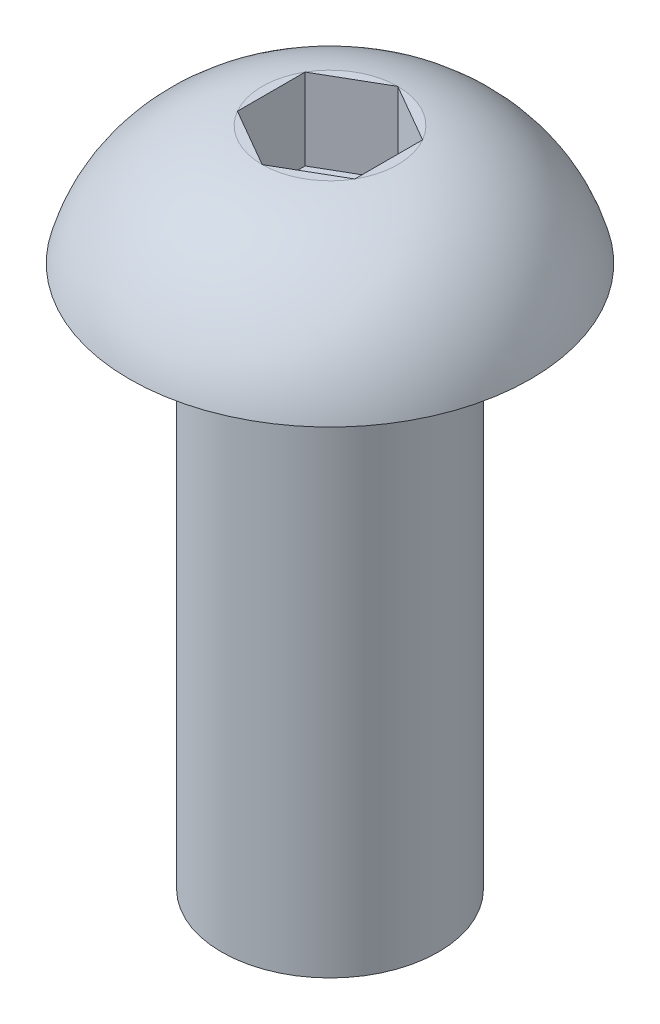
ISO-10303-21;
HEADER;
FILE_DESCRIPTION(('STEP AP214'),'2;1');
FILE_NAME('part.step','',(''),(''),'','','');
FILE_SCHEMA(('AUTOMOTIVE_DESIGN { 1 0 10303 214 1 1 1 1 }'));
ENDSEC;
DATA;
#1=APPLICATION_CONTEXT('core data for automotive mechanical design processes');
#2=APPLICATION_PROTOCOL_DEFINITION('international standard','automotive_design',2000,#1);
#3=PRODUCT_CONTEXT('',#1,'mechanical');
#4=PRODUCT('Part','Part','',(#3));
#5=PRODUCT_RELATED_PRODUCT_CATEGORY('part','',(#4));
#6=PRODUCT_DEFINITION_FORMATION('','',#4);
#7=PRODUCT_DEFINITION_CONTEXT('part definition',#1,'design');
#8=PRODUCT_DEFINITION('design','',#6,#7);
#9=PRODUCT_DEFINITION_SHAPE('','',#8);
#10=(LENGTH_UNIT() NAMED_UNIT(*) SI_UNIT(.MILLI.,.METRE.));
#11=(NAMED_UNIT(*) PLANE_ANGLE_UNIT() SI_UNIT($,.RADIAN.));
#12=(NAMED_UNIT(*) SI_UNIT($,.STERADIAN.) SOLID_ANGLE_UNIT());
#13=UNCERTAINTY_MEASURE_WITH_UNIT(LENGTH_MEASURE(1.E-05),#10,'distance_accuracy_value','');
#14=(GEOMETRIC_REPRESENTATION_CONTEXT(3) GLOBAL_UNCERTAINTY_ASSIGNED_CONTEXT((#13)) GLOBAL_UNIT_ASSIGNED_CONTEXT((#10,
#11,#12)) REPRESENTATION_CONTEXT('',''));
#15=CARTESIAN_POINT('',(0.,0.,0.));
#16=DIRECTION('',(0.,0.,1.));
#17=DIRECTION('',(1.,0.,0.));
#18=AXIS2_PLACEMENT_3D('',#15,#16,#17);
#19=CARTESIAN_POINT('',(0.,2.2,0.));
#20=DIRECTION('',(0.,1.,0.));
#21=DIRECTION('',(0.,0.,1.));
#22=AXIS2_PLACEMENT_3D('',#19,#20,#21);
#23=PLANE('',#22);
#24=DIRECTION('',(-0.866025403784439,0.,-0.5));
#25=VECTOR('',#24,1.);
#26=CARTESIAN_POINT('',(1.08253175473055,2.2,-0.625000000000001));
#27=LINE('',#26,#25);
#28=CARTESIAN_POINT('',(1.08253175473055,2.2,-0.625000000000001));
#29=VERTEX_POINT('',#28);
#30=CARTESIAN_POINT('',(0.,2.2,-1.25));
#31=VERTEX_POINT('',#30);
#32=EDGE_CURVE('E49',#29,#31,#27,.T.);
#33=ORIENTED_EDGE('',*,*,#32,.F.);
#34=CARTESIAN_POINT('',(0.,2.2,0.));
#35=DIRECTION('',(0.,1.,0.));
#36=DIRECTION('',(0.,0.,1.));
#37=AXIS2_PLACEMENT_3D('',#34,#35,#36);
#38=CIRCLE('',#37,1.25);
#39=EDGE_CURVE('E151',#29,#31,#38,.T.);
#40=ORIENTED_EDGE('',*,*,#39,.T.);
#41=EDGE_LOOP('',(#33,#40));
#42=FACE_BOUND('',#41,.T.);
#43=ADVANCED_FACE('F33',(#42),#23,.T.);
#44=DIRECTION('',(0.,0.,-1.));
#45=VECTOR('',#44,1.);
#46=CARTESIAN_POINT('',(1.08253175473055,2.2,0.625000000000001));
#47=LINE('',#46,#45);
#48=CARTESIAN_POINT('',(1.08253175473055,2.2,0.625000000000001));
#49=VERTEX_POINT('',#48);
#50=EDGE_CURVE('E132',#49,#29,#47,.T.);
#51=ORIENTED_EDGE('',*,*,#50,.F.);
#52=EDGE_CURVE('E146',#49,#29,#38,.T.);
#53=ORIENTED_EDGE('',*,*,#52,.T.);
#54=EDGE_LOOP('',(#51,#53));
#55=FACE_BOUND('',#54,.T.);
#56=ADVANCED_FACE('F174',(#55),#23,.T.);
#57=DIRECTION('',(0.866025403784439,0.,-0.5));
#58=VECTOR('',#57,1.);
#59=CARTESIAN_POINT('',(0.,2.2,1.25));
#60=LINE('',#59,#58);
#61=CARTESIAN_POINT('',(0.,2.2,1.25));
#62=VERTEX_POINT('',#61);
#63=EDGE_CURVE('E130',#62,#49,#60,.T.);
#64=ORIENTED_EDGE('',*,*,#63,.F.);
#65=EDGE_CURVE('E144',#62,#49,#38,.T.);
#66=ORIENTED_EDGE('',*,*,#65,.T.);
#67=EDGE_LOOP('',(#64,#66));
#68=FACE_BOUND('',#67,.T.);
#69=ADVANCED_FACE('F176',(#68),#23,.T.);
#70=DIRECTION('',(0.866025403784439,0.,0.5));
#71=VECTOR('',#70,1.);
#72=CARTESIAN_POINT('',(-1.08253175473055,2.2,0.625000000000001));
#73=LINE('',#72,#71);
#74=CARTESIAN_POINT('',(-1.08253175473055,2.2,0.625000000000001));
#75=VERTEX_POINT('',#74);
#76=EDGE_CURVE('E97',#75,#62,#73,.T.);
#77=ORIENTED_EDGE('',*,*,#76,.F.);
#78=EDGE_CURVE('E143',#75,#62,#38,.T.);
#79=ORIENTED_EDGE('',*,*,#78,.T.);
#80=EDGE_LOOP('',(#77,#79));
#81=FACE_BOUND('',#80,.T.);
#82=ADVANCED_FACE('F178',(#81),#23,.T.);
#83=DIRECTION('',(0.,0.,1.));
#84=VECTOR('',#83,1.);
#85=CARTESIAN_POINT('',(-1.08253175473055,2.2,-0.625));
#86=LINE('',#85,#84);
#87=CARTESIAN_POINT('',(-1.08253175473055,2.2,-0.625));
#88=VERTEX_POINT('',#87);
#89=EDGE_CURVE('E126',#88,#75,#86,.T.);
#90=ORIENTED_EDGE('',*,*,#89,.F.);
#91=EDGE_CURVE('E153',#88,#75,#38,.T.);
#92=ORIENTED_EDGE('',*,*,#91,.T.);
#93=EDGE_LOOP('',(#90,#92));
#94=FACE_BOUND('',#93,.T.);
#95=ADVANCED_FACE('F184',(#94),#23,.T.);
#96=CARTESIAN_POINT('',(0.,0.,0.));
#97=DIRECTION('',(0.,1.,0.));
#98=DIRECTION('',(0.,0.,1.));
#99=AXIS2_PLACEMENT_3D('',#96,#97,#98);
#100=PLANE('',#99);
#101=CARTESIAN_POINT('',(0.,0.,0.));
#102=DIRECTION('',(0.,-1.,0.));
#103=DIRECTION('',(0.,0.,-1.));
#104=AXIS2_PLACEMENT_3D('',#101,#102,#103);
#105=CIRCLE('',#104,2.);
#106=CARTESIAN_POINT('',(0.,0.,-2.));
#107=VERTEX_POINT('',#106);
#108=EDGE_CURVE('E11',#107,#107,#105,.T.);
#109=ORIENTED_EDGE('',*,*,#108,.F.);
#110=EDGE_LOOP('',(#109));
#111=FACE_BOUND('',#110,.T.);
#112=CARTESIAN_POINT('',(0.,0.,0.));
#113=DIRECTION('',(0.,1.,0.));
#114=DIRECTION('',(0.,0.,1.));
#115=AXIS2_PLACEMENT_3D('',#112,#113,#114);
#116=CIRCLE('',#115,3.7);
#117=CARTESIAN_POINT('',(0.,0.,3.7));
#118=VERTEX_POINT('',#117);
#119=EDGE_CURVE('E37',#118,#118,#116,.T.);
#120=ORIENTED_EDGE('',*,*,#119,.F.);
#121=EDGE_LOOP('',(#120));
#122=FACE_BOUND('',#121,.T.);
#123=ADVANCED_FACE('F35',(#111,#122),#100,.F.);
#124=CARTESIAN_POINT('',(0.,-0.765971962852529,0.));
#125=DIRECTION('',(0.,1.,0.));
#126=DIRECTION('',(0.,0.,1.));
#127=AXIS2_PLACEMENT_3D('',#124,#125,#126);
#128=DEGENERATE_TOROIDAL_SURFACE('',#127,0.799433339479361,3.,.T.);
#129=ORIENTED_EDGE('',*,*,#65,.F.);
#130=ORIENTED_EDGE('',*,*,#78,.F.);
#131=ORIENTED_EDGE('',*,*,#91,.F.);
#132=EDGE_CURVE('E157',#31,#88,#38,.T.);
#133=ORIENTED_EDGE('',*,*,#132,.F.);
#134=ORIENTED_EDGE('',*,*,#39,.F.);
#135=ORIENTED_EDGE('',*,*,#52,.F.);
#136=EDGE_LOOP('',(#129,#130,#131,#133,#134,#135));
#137=FACE_BOUND('',#136,.T.);
#138=ORIENTED_EDGE('',*,*,#119,.T.);
#139=EDGE_LOOP('',(#138));
#140=FACE_BOUND('',#139,.T.);
#141=ADVANCED_FACE('F170',(#137,#140),#128,.T.);
#142=DIRECTION('',(-0.866025403784439,0.,0.5));
#143=VECTOR('',#142,1.);
#144=CARTESIAN_POINT('',(0.,2.2,-1.25));
#145=LINE('',#144,#143);
#146=EDGE_CURVE('E123',#31,#88,#145,.T.);
#147=ORIENTED_EDGE('',*,*,#146,.F.);
#148=ORIENTED_EDGE('',*,*,#132,.T.);
#149=EDGE_LOOP('',(#147,#148));
#150=FACE_BOUND('',#149,.T.);
#151=ADVANCED_FACE('F185',(#150),#23,.T.);
#152=CARTESIAN_POINT('',(0.,-10.,0.));
#153=DIRECTION('',(0.,1.,0.));
#154=DIRECTION('',(0.,0.,1.));
#155=AXIS2_PLACEMENT_3D('',#152,#153,#154);
#156=CYLINDRICAL_SURFACE('',#155,2.);
#157=CARTESIAN_POINT('',(0.,-10.,0.));
#158=DIRECTION('',(0.,-1.,0.));
#159=DIRECTION('',(0.,0.,-1.));
#160=AXIS2_PLACEMENT_3D('',#157,#158,#159);
#161=CIRCLE('',#160,2.);
#162=CARTESIAN_POINT('',(0.,-10.,-2.));
#163=VERTEX_POINT('',#162);
#164=EDGE_CURVE('E136',#163,#163,#161,.T.);
#165=ORIENTED_EDGE('',*,*,#164,.F.);
#166=EDGE_LOOP('',(#165));
#167=FACE_BOUND('',#166,.T.);
#168=ORIENTED_EDGE('',*,*,#108,.T.);
#169=EDGE_LOOP('',(#168));
#170=FACE_BOUND('',#169,.T.);
#171=ADVANCED_FACE('F191',(#167,#170),#156,.T.);
#172=CARTESIAN_POINT('',(0.,-10.,0.));
#173=DIRECTION('',(0.,-1.,0.));
#174=DIRECTION('',(0.,0.,-1.));
#175=AXIS2_PLACEMENT_3D('',#172,#173,#174);
#176=PLANE('',#175);
#177=ORIENTED_EDGE('',*,*,#164,.T.);
#178=EDGE_LOOP('',(#177));
#179=FACE_BOUND('',#178,.T.);
#180=ADVANCED_FACE('F196',(#179),#176,.T.);
#181=CARTESIAN_POINT('',(1.08253175473055,0.7,-0.625000000000001));
#182=DIRECTION('',(0.5,0.,-0.866025403784439));
#183=DIRECTION('',(-0.866025403784439,0.,-0.5));
#184=AXIS2_PLACEMENT_3D('',#181,#182,#183);
#185=PLANE('',#184);
#186=ORIENTED_EDGE('',*,*,#32,.T.);
#187=DIRECTION('',(0.,1.,0.));
#188=VECTOR('',#187,1.);
#189=CARTESIAN_POINT('',(0.,0.7,-1.25));
#190=LINE('',#189,#188);
#191=CARTESIAN_POINT('',(0.,0.7,-1.25));
#192=VERTEX_POINT('',#191);
#193=EDGE_CURVE('E79',#192,#31,#190,.T.);
#194=ORIENTED_EDGE('',*,*,#193,.F.);
#195=DIRECTION('',(-0.866025403784439,0.,-0.5));
#196=VECTOR('',#195,1.);
#197=CARTESIAN_POINT('',(1.08253175473055,0.7,-0.625000000000001));
#198=LINE('',#197,#196);
#199=CARTESIAN_POINT('',(1.08253175473055,0.7,-0.625000000000001));
#200=VERTEX_POINT('',#199);
#201=EDGE_CURVE('E134',#200,#192,#198,.T.);
#202=ORIENTED_EDGE('',*,*,#201,.F.);
#203=DIRECTION('',(0.,1.,0.));
#204=VECTOR('',#203,1.);
#205=CARTESIAN_POINT('',(1.08253175473055,0.7,-0.625000000000001));
#206=LINE('',#205,#204);
#207=EDGE_CURVE('E57',#200,#29,#206,.T.);
#208=ORIENTED_EDGE('',*,*,#207,.T.);
#209=EDGE_LOOP('',(#186,#194,#202,#208));
#210=FACE_BOUND('',#209,.T.);
#211=ADVANCED_FACE('F208',(#210),#185,.F.);
#212=CARTESIAN_POINT('',(1.08253175473055,0.7,0.625000000000001));
#213=DIRECTION('',(1.,0.,0.));
#214=DIRECTION('',(0.,0.,-1.));
#215=AXIS2_PLACEMENT_3D('',#212,#213,#214);
#216=PLANE('',#215);
#217=ORIENTED_EDGE('',*,*,#50,.T.);
#218=ORIENTED_EDGE('',*,*,#207,.F.);
#219=DIRECTION('',(0.,0.,-1.));
#220=VECTOR('',#219,1.);
#221=CARTESIAN_POINT('',(1.08253175473055,0.7,0.625000000000001));
#222=LINE('',#221,#220);
#223=CARTESIAN_POINT('',(1.08253175473055,0.7,0.625000000000001));
#224=VERTEX_POINT('',#223);
#225=EDGE_CURVE('E109',#224,#200,#222,.T.);
#226=ORIENTED_EDGE('',*,*,#225,.F.);
#227=DIRECTION('',(0.,1.,0.));
#228=VECTOR('',#227,1.);
#229=CARTESIAN_POINT('',(1.08253175473055,0.7,0.625000000000001));
#230=LINE('',#229,#228);
#231=EDGE_CURVE('E101',#224,#49,#230,.T.);
#232=ORIENTED_EDGE('',*,*,#231,.T.);
#233=EDGE_LOOP('',(#217,#218,#226,#232));
#234=FACE_BOUND('',#233,.T.);
#235=ADVANCED_FACE('F175',(#234),#216,.F.);
#236=CARTESIAN_POINT('',(0.,0.7,1.25));
#237=DIRECTION('',(0.5,0.,0.866025403784439));
#238=DIRECTION('',(0.866025403784439,0.,-0.5));
#239=AXIS2_PLACEMENT_3D('',#236,#237,#238);
#240=PLANE('',#239);
#241=ORIENTED_EDGE('',*,*,#63,.T.);
#242=ORIENTED_EDGE('',*,*,#231,.F.);
#243=DIRECTION('',(0.866025403784439,0.,-0.5));
#244=VECTOR('',#243,1.);
#245=CARTESIAN_POINT('',(0.,0.7,1.25));
#246=LINE('',#245,#244);
#247=CARTESIAN_POINT('',(0.,0.7,1.25));
#248=VERTEX_POINT('',#247);
#249=EDGE_CURVE('E105',#248,#224,#246,.T.);
#250=ORIENTED_EDGE('',*,*,#249,.F.);
#251=DIRECTION('',(0.,1.,0.));
#252=VECTOR('',#251,1.);
#253=CARTESIAN_POINT('',(0.,0.7,1.25));
#254=LINE('',#253,#252);
#255=EDGE_CURVE('E90',#248,#62,#254,.T.);
#256=ORIENTED_EDGE('',*,*,#255,.T.);
#257=EDGE_LOOP('',(#241,#242,#250,#256));
#258=FACE_BOUND('',#257,.T.);
#259=ADVANCED_FACE('F106',(#258),#240,.F.);
#260=CARTESIAN_POINT('',(-1.08253175473055,0.7,0.625000000000001));
#261=DIRECTION('',(-0.5,0.,0.866025403784439));
#262=DIRECTION('',(0.866025403784439,0.,0.5));
#263=AXIS2_PLACEMENT_3D('',#260,#261,#262);
#264=PLANE('',#263);
#265=ORIENTED_EDGE('',*,*,#76,.T.);
#266=ORIENTED_EDGE('',*,*,#255,.F.);
#267=DIRECTION('',(0.866025403784439,0.,0.5));
#268=VECTOR('',#267,1.);
#269=CARTESIAN_POINT('',(-1.08253175473055,0.7,0.625000000000001));
#270=LINE('',#269,#268);
#271=CARTESIAN_POINT('',(-1.08253175473055,0.7,0.625000000000001));
#272=VERTEX_POINT('',#271);
#273=EDGE_CURVE('E94',#272,#248,#270,.T.);
#274=ORIENTED_EDGE('',*,*,#273,.F.);
#275=DIRECTION('',(0.,1.,0.));
#276=VECTOR('',#275,1.);
#277=CARTESIAN_POINT('',(-1.08253175473055,0.7,0.625000000000001));
#278=LINE('',#277,#276);
#279=EDGE_CURVE('E102',#272,#75,#278,.T.);
#280=ORIENTED_EDGE('',*,*,#279,.T.);
#281=EDGE_LOOP('',(#265,#266,#274,#280));
#282=FACE_BOUND('',#281,.T.);
#283=ADVANCED_FACE('F92',(#282),#264,.F.);
#284=CARTESIAN_POINT('',(-1.08253175473055,0.7,-0.625));
#285=DIRECTION('',(-1.,0.,0.));
#286=DIRECTION('',(0.,0.,1.));
#287=AXIS2_PLACEMENT_3D('',#284,#285,#286);
#288=PLANE('',#287);
#289=ORIENTED_EDGE('',*,*,#89,.T.);
#290=ORIENTED_EDGE('',*,*,#279,.F.);
#291=DIRECTION('',(0.,0.,1.));
#292=VECTOR('',#291,1.);
#293=CARTESIAN_POINT('',(-1.08253175473055,0.7,-0.625));
#294=LINE('',#293,#292);
#295=CARTESIAN_POINT('',(-1.08253175473055,0.7,-0.625));
#296=VERTEX_POINT('',#295);
#297=EDGE_CURVE('E115',#296,#272,#294,.T.);
#298=ORIENTED_EDGE('',*,*,#297,.F.);
#299=DIRECTION('',(0.,1.,0.));
#300=VECTOR('',#299,1.);
#301=CARTESIAN_POINT('',(-1.08253175473055,0.7,-0.625));
#302=LINE('',#301,#300);
#303=EDGE_CURVE('E139',#296,#88,#302,.T.);
#304=ORIENTED_EDGE('',*,*,#303,.T.);
#305=EDGE_LOOP('',(#289,#290,#298,#304));
#306=FACE_BOUND('',#305,.T.);
#307=ADVANCED_FACE('F204',(#306),#288,.F.);
#308=CARTESIAN_POINT('',(0.,0.7,-1.25));
#309=DIRECTION('',(-0.5,0.,-0.866025403784438));
#310=DIRECTION('',(-0.866025403784439,0.,0.5));
#311=AXIS2_PLACEMENT_3D('',#308,#309,#310);
#312=PLANE('',#311);
#313=ORIENTED_EDGE('',*,*,#146,.T.);
#314=ORIENTED_EDGE('',*,*,#303,.F.);
#315=DIRECTION('',(-0.866025403784439,0.,0.5));
#316=VECTOR('',#315,1.);
#317=CARTESIAN_POINT('',(0.,0.7,-1.25));
#318=LINE('',#317,#316);
#319=EDGE_CURVE('E117',#192,#296,#318,.T.);
#320=ORIENTED_EDGE('',*,*,#319,.F.);
#321=ORIENTED_EDGE('',*,*,#193,.T.);
#322=EDGE_LOOP('',(#313,#314,#320,#321));
#323=FACE_BOUND('',#322,.T.);
#324=ADVANCED_FACE('F206',(#323),#312,.F.);
#325=CARTESIAN_POINT('',(0.,0.7,0.));
#326=DIRECTION('',(0.,1.,0.));
#327=DIRECTION('',(0.,0.,1.));
#328=AXIS2_PLACEMENT_3D('',#325,#326,#327);
#329=PLANE('',#328);
#330=ORIENTED_EDGE('',*,*,#201,.T.);
#331=ORIENTED_EDGE('',*,*,#319,.T.);
#332=ORIENTED_EDGE('',*,*,#297,.T.);
#333=ORIENTED_EDGE('',*,*,#273,.T.);
#334=ORIENTED_EDGE('',*,*,#249,.T.);
#335=ORIENTED_EDGE('',*,*,#225,.T.);
#336=EDGE_LOOP('',(#330,#331,#332,#333,#334,#335));
#337=FACE_BOUND('',#336,.T.);
#338=ADVANCED_FACE('F112',(#337),#329,.T.);
#339=CLOSED_SHELL('',(#43,#56,#69,#82,#95,#123,#141,#151,#171,#180,#211,#235,#259,#283,#307,
#324,#338));
#340=MANIFOLD_SOLID_BREP('B2',#339);
#341=ADVANCED_BREP_SHAPE_REPRESENTATION('',(#18,#340),#14);
#342=SHAPE_DEFINITION_REPRESENTATION(#9,#341);
ENDSEC;
END-ISO-10303-21;
